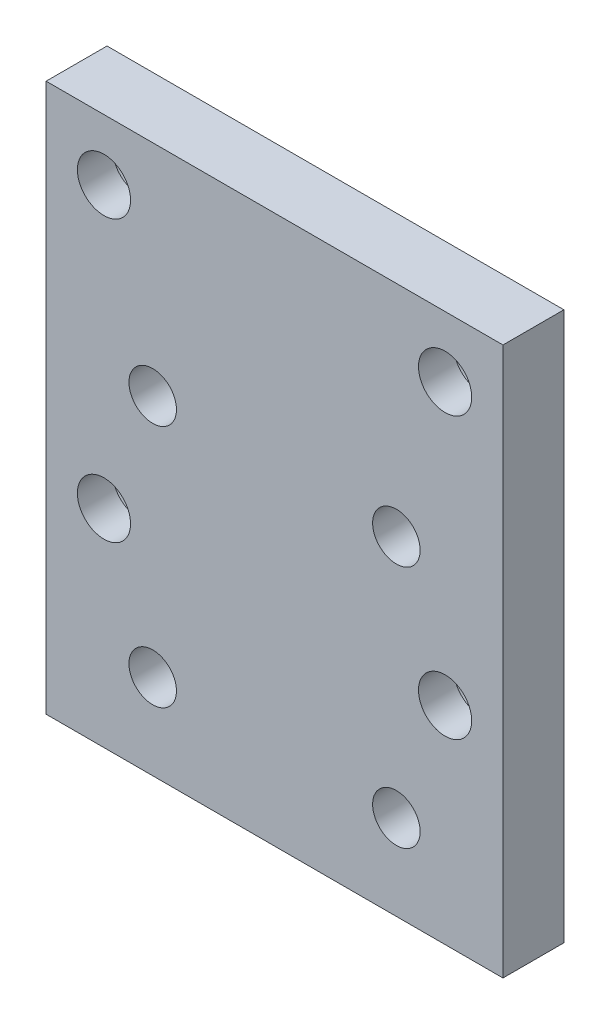
ISO-10303-21;
HEADER;
FILE_DESCRIPTION(('STEP AP214'),'2;1');
FILE_NAME('part.step','',(''),(''),'','','');
FILE_SCHEMA(('AUTOMOTIVE_DESIGN { 1 0 10303 214 1 1 1 1 }'));
ENDSEC;
DATA;
#1=APPLICATION_CONTEXT('core data for automotive mechanical design processes');
#2=APPLICATION_PROTOCOL_DEFINITION('international standard','automotive_design',2000,#1);
#3=PRODUCT_CONTEXT('',#1,'mechanical');
#4=PRODUCT('Part','Part','',(#3));
#5=PRODUCT_RELATED_PRODUCT_CATEGORY('part','',(#4));
#6=PRODUCT_DEFINITION_FORMATION('','',#4);
#7=PRODUCT_DEFINITION_CONTEXT('part definition',#1,'design');
#8=PRODUCT_DEFINITION('design','',#6,#7);
#9=PRODUCT_DEFINITION_SHAPE('','',#8);
#10=(LENGTH_UNIT() NAMED_UNIT(*) SI_UNIT(.MILLI.,.METRE.));
#11=(NAMED_UNIT(*) PLANE_ANGLE_UNIT() SI_UNIT($,.RADIAN.));
#12=(NAMED_UNIT(*) SI_UNIT($,.STERADIAN.) SOLID_ANGLE_UNIT());
#13=UNCERTAINTY_MEASURE_WITH_UNIT(LENGTH_MEASURE(1.E-05),#10,'distance_accuracy_value','');
#14=(GEOMETRIC_REPRESENTATION_CONTEXT(3) GLOBAL_UNCERTAINTY_ASSIGNED_CONTEXT((#13)) GLOBAL_UNIT_ASSIGNED_CONTEXT((#10,
#11,#12)) REPRESENTATION_CONTEXT('',''));
#15=CARTESIAN_POINT('',(0.,0.,0.));
#16=DIRECTION('',(0.,0.,1.));
#17=DIRECTION('',(1.,0.,0.));
#18=AXIS2_PLACEMENT_3D('',#15,#16,#17);
#19=CARTESIAN_POINT('',(75.,-45.,-5.));
#20=DIRECTION('',(0.,0.,1.));
#21=DIRECTION('',(1.,0.,0.));
#22=AXIS2_PLACEMENT_3D('',#19,#20,#21);
#23=PLANE('',#22);
#24=CARTESIAN_POINT('',(17.5,-31.,-5.));
#25=DIRECTION('',(0.,0.,-1.));
#26=DIRECTION('',(-1.,0.,0.));
#27=AXIS2_PLACEMENT_3D('',#24,#25,#26);
#28=CIRCLE('',#27,3.9);
#29=CARTESIAN_POINT('',(13.6,-31.,-5.));
#30=VERTEX_POINT('',#29);
#31=EDGE_CURVE('E216',#30,#30,#28,.T.);
#32=ORIENTED_EDGE('',*,*,#31,.F.);
#33=EDGE_LOOP('',(#32));
#34=FACE_BOUND('',#33,.T.);
#35=CARTESIAN_POINT('',(17.5,8.99999999999999,-5.));
#36=DIRECTION('',(0.,0.,-1.));
#37=DIRECTION('',(-1.,0.,0.));
#38=AXIS2_PLACEMENT_3D('',#35,#36,#37);
#39=CIRCLE('',#38,3.9);
#40=CARTESIAN_POINT('',(13.6,8.99999999999999,-5.));
#41=VERTEX_POINT('',#40);
#42=EDGE_CURVE('E224',#41,#41,#39,.T.);
#43=ORIENTED_EDGE('',*,*,#42,.F.);
#44=EDGE_LOOP('',(#43));
#45=FACE_BOUND('',#44,.T.);
#46=CARTESIAN_POINT('',(57.5,8.99999999999999,-5.));
#47=DIRECTION('',(0.,0.,-1.));
#48=DIRECTION('',(-1.,0.,0.));
#49=AXIS2_PLACEMENT_3D('',#46,#47,#48);
#50=CIRCLE('',#49,3.9);
#51=CARTESIAN_POINT('',(53.6,8.99999999999999,-5.));
#52=VERTEX_POINT('',#51);
#53=EDGE_CURVE('E232',#52,#52,#50,.T.);
#54=ORIENTED_EDGE('',*,*,#53,.F.);
#55=EDGE_LOOP('',(#54));
#56=FACE_BOUND('',#55,.T.);
#57=CARTESIAN_POINT('',(57.5,-31.,-5.));
#58=DIRECTION('',(0.,0.,-1.));
#59=DIRECTION('',(-1.,0.,0.));
#60=AXIS2_PLACEMENT_3D('',#57,#58,#59);
#61=CIRCLE('',#60,3.9);
#62=CARTESIAN_POINT('',(53.6,-31.,-5.));
#63=VERTEX_POINT('',#62);
#64=EDGE_CURVE('E208',#63,#63,#61,.T.);
#65=ORIENTED_EDGE('',*,*,#64,.F.);
#66=EDGE_LOOP('',(#65));
#67=FACE_BOUND('',#66,.T.);
#68=CARTESIAN_POINT('',(65.5,35.,-5.));
#69=DIRECTION('',(0.,0.,-1.));
#70=DIRECTION('',(-1.,0.,0.));
#71=AXIS2_PLACEMENT_3D('',#68,#69,#70);
#72=CIRCLE('',#71,7.97687);
#73=CARTESIAN_POINT('',(57.52313,35.,-5.));
#74=VERTEX_POINT('',#73);
#75=EDGE_CURVE('E203',#74,#74,#72,.T.);
#76=ORIENTED_EDGE('',*,*,#75,.F.);
#77=EDGE_LOOP('',(#76));
#78=FACE_BOUND('',#77,.T.);
#79=CARTESIAN_POINT('',(65.5,-11.,-5.));
#80=DIRECTION('',(0.,0.,-1.));
#81=DIRECTION('',(-1.,0.,0.));
#82=AXIS2_PLACEMENT_3D('',#79,#80,#81);
#83=CIRCLE('',#82,7.97687);
#84=CARTESIAN_POINT('',(57.52313,-11.,-5.));
#85=VERTEX_POINT('',#84);
#86=EDGE_CURVE('E183',#85,#85,#83,.T.);
#87=ORIENTED_EDGE('',*,*,#86,.F.);
#88=EDGE_LOOP('',(#87));
#89=FACE_BOUND('',#88,.T.);
#90=CARTESIAN_POINT('',(9.49999999999999,35.,-5.));
#91=DIRECTION('',(0.,0.,-1.));
#92=DIRECTION('',(-1.,0.,0.));
#93=AXIS2_PLACEMENT_3D('',#90,#91,#92);
#94=CIRCLE('',#93,7.97687);
#95=CARTESIAN_POINT('',(1.52312999999999,35.,-5.));
#96=VERTEX_POINT('',#95);
#97=EDGE_CURVE('E163',#96,#96,#94,.T.);
#98=ORIENTED_EDGE('',*,*,#97,.F.);
#99=EDGE_LOOP('',(#98));
#100=FACE_BOUND('',#99,.T.);
#101=CARTESIAN_POINT('',(9.49999999999998,-11.,-5.));
#102=DIRECTION('',(0.,0.,-1.));
#103=DIRECTION('',(-1.,0.,0.));
#104=AXIS2_PLACEMENT_3D('',#101,#102,#103);
#105=CIRCLE('',#104,7.97687);
#106=CARTESIAN_POINT('',(1.52312999999998,-11.,-5.));
#107=VERTEX_POINT('',#106);
#108=EDGE_CURVE('E143',#107,#107,#105,.T.);
#109=ORIENTED_EDGE('',*,*,#108,.F.);
#110=EDGE_LOOP('',(#109));
#111=FACE_BOUND('',#110,.T.);
#112=DIRECTION('',(0.,1.,0.));
#113=VECTOR('',#112,1.);
#114=CARTESIAN_POINT('',(0.,-45.,-5.));
#115=LINE('',#114,#113);
#116=CARTESIAN_POINT('',(0.,-45.,-5.));
#117=VERTEX_POINT('',#116);
#118=CARTESIAN_POINT('',(0.,45.,-5.));
#119=VERTEX_POINT('',#118);
#120=EDGE_CURVE('E107',#117,#119,#115,.T.);
#121=ORIENTED_EDGE('',*,*,#120,.T.);
#122=DIRECTION('',(-1.,0.,0.));
#123=VECTOR('',#122,1.);
#124=CARTESIAN_POINT('',(75.,45.,-5.));
#125=LINE('',#124,#123);
#126=CARTESIAN_POINT('',(75.,45.,-5.));
#127=VERTEX_POINT('',#126);
#128=EDGE_CURVE('E11',#127,#119,#125,.T.);
#129=ORIENTED_EDGE('',*,*,#128,.F.);
#130=DIRECTION('',(0.,1.,0.));
#131=VECTOR('',#130,1.);
#132=CARTESIAN_POINT('',(75.,-45.,-5.));
#133=LINE('',#132,#131);
#134=CARTESIAN_POINT('',(75.,-45.,-5.));
#135=VERTEX_POINT('',#134);
#136=EDGE_CURVE('E91',#135,#127,#133,.T.);
#137=ORIENTED_EDGE('',*,*,#136,.F.);
#138=DIRECTION('',(-1.,0.,0.));
#139=VECTOR('',#138,1.);
#140=CARTESIAN_POINT('',(75.,-45.,-5.));
#141=LINE('',#140,#139);
#142=EDGE_CURVE('E103',#135,#117,#141,.T.);
#143=ORIENTED_EDGE('',*,*,#142,.T.);
#144=EDGE_LOOP('',(#121,#129,#137,#143));
#145=FACE_BOUND('',#144,.T.);
#146=ADVANCED_FACE('F39',(#34,#45,#56,#67,#78,#89,#100,#111,#145),#23,.F.);
#147=CARTESIAN_POINT('',(75.,45.,5.));
#148=DIRECTION('',(0.,-1.,0.));
#149=DIRECTION('',(0.,0.,-1.));
#150=AXIS2_PLACEMENT_3D('',#147,#148,#149);
#151=PLANE('',#150);
#152=DIRECTION('',(0.,0.,1.));
#153=VECTOR('',#152,1.);
#154=CARTESIAN_POINT('',(0.,45.,5.));
#155=LINE('',#154,#153);
#156=CARTESIAN_POINT('',(0.,45.,5.));
#157=VERTEX_POINT('',#156);
#158=EDGE_CURVE('E96',#119,#157,#155,.T.);
#159=ORIENTED_EDGE('',*,*,#158,.T.);
#160=DIRECTION('',(-1.,0.,0.));
#161=VECTOR('',#160,1.);
#162=CARTESIAN_POINT('',(75.,45.,5.));
#163=LINE('',#162,#161);
#164=CARTESIAN_POINT('',(75.,45.,5.));
#165=VERTEX_POINT('',#164);
#166=EDGE_CURVE('E48',#165,#157,#163,.T.);
#167=ORIENTED_EDGE('',*,*,#166,.F.);
#168=DIRECTION('',(0.,0.,1.));
#169=VECTOR('',#168,1.);
#170=CARTESIAN_POINT('',(75.,45.,5.));
#171=LINE('',#170,#169);
#172=EDGE_CURVE('E86',#127,#165,#171,.T.);
#173=ORIENTED_EDGE('',*,*,#172,.F.);
#174=ORIENTED_EDGE('',*,*,#128,.T.);
#175=EDGE_LOOP('',(#159,#167,#173,#174));
#176=FACE_BOUND('',#175,.T.);
#177=ADVANCED_FACE('F95',(#176),#151,.F.);
#178=CARTESIAN_POINT('',(75.,-45.,5.));
#179=DIRECTION('',(0.,0.,-1.));
#180=DIRECTION('',(-1.,0.,0.));
#181=AXIS2_PLACEMENT_3D('',#178,#179,#180);
#182=PLANE('',#181);
#183=CARTESIAN_POINT('',(17.5,-31.,5.));
#184=DIRECTION('',(0.,0.,-1.));
#185=DIRECTION('',(-1.,0.,0.));
#186=AXIS2_PLACEMENT_3D('',#183,#184,#185);
#187=CIRCLE('',#186,3.9);
#188=CARTESIAN_POINT('',(13.6,-31.,5.));
#189=VERTEX_POINT('',#188);
#190=EDGE_CURVE('E220',#189,#189,#187,.T.);
#191=ORIENTED_EDGE('',*,*,#190,.T.);
#192=EDGE_LOOP('',(#191));
#193=FACE_BOUND('',#192,.T.);
#194=CARTESIAN_POINT('',(17.5,8.99999999999999,5.));
#195=DIRECTION('',(0.,0.,-1.));
#196=DIRECTION('',(-1.,0.,0.));
#197=AXIS2_PLACEMENT_3D('',#194,#195,#196);
#198=CIRCLE('',#197,3.9);
#199=CARTESIAN_POINT('',(13.6,8.99999999999999,5.));
#200=VERTEX_POINT('',#199);
#201=EDGE_CURVE('E228',#200,#200,#198,.T.);
#202=ORIENTED_EDGE('',*,*,#201,.T.);
#203=EDGE_LOOP('',(#202));
#204=FACE_BOUND('',#203,.T.);
#205=CARTESIAN_POINT('',(57.5,8.99999999999999,5.));
#206=DIRECTION('',(0.,0.,-1.));
#207=DIRECTION('',(-1.,0.,0.));
#208=AXIS2_PLACEMENT_3D('',#205,#206,#207);
#209=CIRCLE('',#208,3.9);
#210=CARTESIAN_POINT('',(53.6,8.99999999999999,5.));
#211=VERTEX_POINT('',#210);
#212=EDGE_CURVE('E212',#211,#211,#209,.T.);
#213=ORIENTED_EDGE('',*,*,#212,.T.);
#214=EDGE_LOOP('',(#213));
#215=FACE_BOUND('',#214,.T.);
#216=CARTESIAN_POINT('',(57.5,-31.,5.));
#217=DIRECTION('',(0.,0.,-1.));
#218=DIRECTION('',(-1.,0.,0.));
#219=AXIS2_PLACEMENT_3D('',#216,#217,#218);
#220=CIRCLE('',#219,3.9);
#221=CARTESIAN_POINT('',(53.6,-31.,5.));
#222=VERTEX_POINT('',#221);
#223=EDGE_CURVE('E207',#222,#222,#220,.T.);
#224=ORIENTED_EDGE('',*,*,#223,.T.);
#225=EDGE_LOOP('',(#224));
#226=FACE_BOUND('',#225,.T.);
#227=CARTESIAN_POINT('',(65.5,35.,5.));
#228=DIRECTION('',(0.,0.,-1.));
#229=DIRECTION('',(-1.,0.,0.));
#230=AXIS2_PLACEMENT_3D('',#227,#228,#229);
#231=CIRCLE('',#230,4.36499);
#232=CARTESIAN_POINT('',(61.13501,35.,5.));
#233=VERTEX_POINT('',#232);
#234=EDGE_CURVE('E187',#233,#233,#231,.T.);
#235=ORIENTED_EDGE('',*,*,#234,.T.);
#236=EDGE_LOOP('',(#235));
#237=FACE_BOUND('',#236,.T.);
#238=CARTESIAN_POINT('',(65.5,-11.,5.));
#239=DIRECTION('',(0.,0.,-1.));
#240=DIRECTION('',(-1.,0.,0.));
#241=AXIS2_PLACEMENT_3D('',#238,#239,#240);
#242=CIRCLE('',#241,4.36499);
#243=CARTESIAN_POINT('',(61.13501,-11.,5.));
#244=VERTEX_POINT('',#243);
#245=EDGE_CURVE('E167',#244,#244,#242,.T.);
#246=ORIENTED_EDGE('',*,*,#245,.T.);
#247=EDGE_LOOP('',(#246));
#248=FACE_BOUND('',#247,.T.);
#249=CARTESIAN_POINT('',(9.49999999999999,35.,5.));
#250=DIRECTION('',(0.,0.,-1.));
#251=DIRECTION('',(-1.,0.,0.));
#252=AXIS2_PLACEMENT_3D('',#249,#250,#251);
#253=CIRCLE('',#252,4.36499);
#254=CARTESIAN_POINT('',(5.13501,35.,5.));
#255=VERTEX_POINT('',#254);
#256=EDGE_CURVE('E147',#255,#255,#253,.T.);
#257=ORIENTED_EDGE('',*,*,#256,.T.);
#258=EDGE_LOOP('',(#257));
#259=FACE_BOUND('',#258,.T.);
#260=CARTESIAN_POINT('',(9.49999999999998,-11.,5.));
#261=DIRECTION('',(0.,0.,-1.));
#262=DIRECTION('',(-1.,0.,0.));
#263=AXIS2_PLACEMENT_3D('',#260,#261,#262);
#264=CIRCLE('',#263,4.36499);
#265=CARTESIAN_POINT('',(5.13500999999998,-11.,5.));
#266=VERTEX_POINT('',#265);
#267=EDGE_CURVE('E111',#266,#266,#264,.T.);
#268=ORIENTED_EDGE('',*,*,#267,.T.);
#269=EDGE_LOOP('',(#268));
#270=FACE_BOUND('',#269,.T.);
#271=DIRECTION('',(0.,-1.,0.));
#272=VECTOR('',#271,1.);
#273=CARTESIAN_POINT('',(0.,-45.,5.));
#274=LINE('',#273,#272);
#275=CARTESIAN_POINT('',(0.,-45.,5.));
#276=VERTEX_POINT('',#275);
#277=EDGE_CURVE('E73',#157,#276,#274,.T.);
#278=ORIENTED_EDGE('',*,*,#277,.T.);
#279=DIRECTION('',(-1.,0.,0.));
#280=VECTOR('',#279,1.);
#281=CARTESIAN_POINT('',(75.,-45.,5.));
#282=LINE('',#281,#280);
#283=CARTESIAN_POINT('',(75.,-45.,5.));
#284=VERTEX_POINT('',#283);
#285=EDGE_CURVE('E98',#284,#276,#282,.T.);
#286=ORIENTED_EDGE('',*,*,#285,.F.);
#287=DIRECTION('',(0.,-1.,0.));
#288=VECTOR('',#287,1.);
#289=CARTESIAN_POINT('',(75.,-45.,5.));
#290=LINE('',#289,#288);
#291=EDGE_CURVE('E89',#165,#284,#290,.T.);
#292=ORIENTED_EDGE('',*,*,#291,.F.);
#293=ORIENTED_EDGE('',*,*,#166,.T.);
#294=EDGE_LOOP('',(#278,#286,#292,#293));
#295=FACE_BOUND('',#294,.T.);
#296=ADVANCED_FACE('F99',(#193,#204,#215,#226,#237,#248,#259,#270,#295),#182,.F.);
#297=CARTESIAN_POINT('',(75.,-45.,5.));
#298=DIRECTION('',(0.,1.,0.));
#299=DIRECTION('',(0.,0.,1.));
#300=AXIS2_PLACEMENT_3D('',#297,#298,#299);
#301=PLANE('',#300);
#302=DIRECTION('',(0.,0.,-1.));
#303=VECTOR('',#302,1.);
#304=CARTESIAN_POINT('',(0.,-45.,5.));
#305=LINE('',#304,#303);
#306=EDGE_CURVE('E79',#276,#117,#305,.T.);
#307=ORIENTED_EDGE('',*,*,#306,.T.);
#308=ORIENTED_EDGE('',*,*,#142,.F.);
#309=DIRECTION('',(0.,0.,-1.));
#310=VECTOR('',#309,1.);
#311=CARTESIAN_POINT('',(75.,-45.,5.));
#312=LINE('',#311,#310);
#313=EDGE_CURVE('E56',#284,#135,#312,.T.);
#314=ORIENTED_EDGE('',*,*,#313,.F.);
#315=ORIENTED_EDGE('',*,*,#285,.T.);
#316=EDGE_LOOP('',(#307,#308,#314,#315));
#317=FACE_BOUND('',#316,.T.);
#318=ADVANCED_FACE('F121',(#317),#301,.F.);
#319=CARTESIAN_POINT('',(75.,0.,0.));
#320=DIRECTION('',(-1.,0.,0.));
#321=DIRECTION('',(0.,0.,1.));
#322=AXIS2_PLACEMENT_3D('',#319,#320,#321);
#323=PLANE('',#322);
#324=ORIENTED_EDGE('',*,*,#136,.T.);
#325=ORIENTED_EDGE('',*,*,#172,.T.);
#326=ORIENTED_EDGE('',*,*,#291,.T.);
#327=ORIENTED_EDGE('',*,*,#313,.T.);
#328=EDGE_LOOP('',(#324,#325,#326,#327));
#329=FACE_BOUND('',#328,.T.);
#330=ADVANCED_FACE('F87',(#329),#323,.F.);
#331=CARTESIAN_POINT('',(0.,0.,0.));
#332=DIRECTION('',(-1.,0.,0.));
#333=DIRECTION('',(0.,0.,1.));
#334=AXIS2_PLACEMENT_3D('',#331,#332,#333);
#335=PLANE('',#334);
#336=ORIENTED_EDGE('',*,*,#120,.F.);
#337=ORIENTED_EDGE('',*,*,#306,.F.);
#338=ORIENTED_EDGE('',*,*,#277,.F.);
#339=ORIENTED_EDGE('',*,*,#158,.F.);
#340=EDGE_LOOP('',(#336,#337,#338,#339));
#341=FACE_BOUND('',#340,.T.);
#342=ADVANCED_FACE('F124',(#341),#335,.T.);
#343=CARTESIAN_POINT('',(9.49999999999998,-11.,-5.));
#344=DIRECTION('',(0.,0.,-1.));
#345=DIRECTION('',(-1.,0.,0.));
#346=AXIS2_PLACEMENT_3D('',#343,#344,#345);
#347=CYLINDRICAL_SURFACE('',#346,4.36499);
#348=ORIENTED_EDGE('',*,*,#267,.F.);
#349=EDGE_LOOP('',(#348));
#350=FACE_BOUND('',#349,.T.);
#351=CARTESIAN_POINT('',(9.49999999999998,-11.,-0.783600000000001));
#352=DIRECTION('',(0.,0.,-1.));
#353=DIRECTION('',(-1.,0.,0.));
#354=AXIS2_PLACEMENT_3D('',#351,#352,#353);
#355=CIRCLE('',#354,4.36499);
#356=CARTESIAN_POINT('',(5.13500999999998,-11.,-0.783600000000001));
#357=VERTEX_POINT('',#356);
#358=EDGE_CURVE('E131',#357,#357,#355,.T.);
#359=ORIENTED_EDGE('',*,*,#358,.T.);
#360=EDGE_LOOP('',(#359));
#361=FACE_BOUND('',#360,.T.);
#362=ADVANCED_FACE('F284',(#350,#361),#347,.F.);
#363=CARTESIAN_POINT('',(16.84187,-11.,-0.783600000000001));
#364=DIRECTION('',(0.,0.,1.));
#365=DIRECTION('',(1.,0.,0.));
#366=AXIS2_PLACEMENT_3D('',#363,#364,#365);
#367=PLANE('',#366);
#368=ORIENTED_EDGE('',*,*,#358,.F.);
#369=EDGE_LOOP('',(#368));
#370=FACE_BOUND('',#369,.T.);
#371=CARTESIAN_POINT('',(9.49999999999998,-11.,-0.783600000000001));
#372=DIRECTION('',(0.,0.,-1.));
#373=DIRECTION('',(-1.,0.,0.));
#374=AXIS2_PLACEMENT_3D('',#371,#372,#373);
#375=CIRCLE('',#374,7.34187);
#376=CARTESIAN_POINT('',(2.15812999999998,-11.,-0.783600000000001));
#377=VERTEX_POINT('',#376);
#378=EDGE_CURVE('E135',#377,#377,#375,.T.);
#379=ORIENTED_EDGE('',*,*,#378,.T.);
#380=EDGE_LOOP('',(#379));
#381=FACE_BOUND('',#380,.T.);
#382=ADVANCED_FACE('F276',(#370,#381),#367,.F.);
#383=CARTESIAN_POINT('',(9.49999999999998,-11.,-5.));
#384=DIRECTION('',(0.,0.,-1.));
#385=DIRECTION('',(-1.,0.,0.));
#386=AXIS2_PLACEMENT_3D('',#383,#384,#385);
#387=CYLINDRICAL_SURFACE('',#386,7.34187);
#388=ORIENTED_EDGE('',*,*,#378,.F.);
#389=EDGE_LOOP('',(#388));
#390=FACE_BOUND('',#389,.T.);
#391=CARTESIAN_POINT('',(9.49999999999998,-11.,-4.365));
#392=DIRECTION('',(0.,0.,-1.));
#393=DIRECTION('',(-1.,0.,0.));
#394=AXIS2_PLACEMENT_3D('',#391,#392,#393);
#395=CIRCLE('',#394,7.34187);
#396=CARTESIAN_POINT('',(2.15812999999998,-11.,-4.365));
#397=VERTEX_POINT('',#396);
#398=EDGE_CURVE('E139',#397,#397,#395,.T.);
#399=ORIENTED_EDGE('',*,*,#398,.T.);
#400=EDGE_LOOP('',(#399));
#401=FACE_BOUND('',#400,.T.);
#402=ADVANCED_FACE('F266',(#390,#401),#387,.F.);
#403=CARTESIAN_POINT('',(9.49999999999998,-11.,-5.));
#404=DIRECTION('',(0.,0.,-1.));
#405=DIRECTION('',(-1.,0.,0.));
#406=AXIS2_PLACEMENT_3D('',#403,#404,#405);
#407=CONICAL_SURFACE('',#406,7.97687,0.785398163397447);
#408=ORIENTED_EDGE('',*,*,#398,.F.);
#409=EDGE_LOOP('',(#408));
#410=FACE_BOUND('',#409,.T.);
#411=ORIENTED_EDGE('',*,*,#108,.T.);
#412=EDGE_LOOP('',(#411));
#413=FACE_BOUND('',#412,.T.);
#414=ADVANCED_FACE('F263',(#410,#413),#407,.F.);
#415=CARTESIAN_POINT('',(9.49999999999999,35.,-5.));
#416=DIRECTION('',(0.,0.,-1.));
#417=DIRECTION('',(-1.,0.,0.));
#418=AXIS2_PLACEMENT_3D('',#415,#416,#417);
#419=CYLINDRICAL_SURFACE('',#418,4.36499);
#420=ORIENTED_EDGE('',*,*,#256,.F.);
#421=EDGE_LOOP('',(#420));
#422=FACE_BOUND('',#421,.T.);
#423=CARTESIAN_POINT('',(9.49999999999999,35.,-0.783600000000001));
#424=DIRECTION('',(0.,0.,-1.));
#425=DIRECTION('',(-1.,0.,0.));
#426=AXIS2_PLACEMENT_3D('',#423,#424,#425);
#427=CIRCLE('',#426,4.36499);
#428=CARTESIAN_POINT('',(5.13500999999999,35.,-0.783600000000001));
#429=VERTEX_POINT('',#428);
#430=EDGE_CURVE('E151',#429,#429,#427,.T.);
#431=ORIENTED_EDGE('',*,*,#430,.T.);
#432=EDGE_LOOP('',(#431));
#433=FACE_BOUND('',#432,.T.);
#434=ADVANCED_FACE('F265',(#422,#433),#419,.F.);
#435=CARTESIAN_POINT('',(16.84187,35.,-0.783600000000001));
#436=DIRECTION('',(0.,0.,1.));
#437=DIRECTION('',(1.,0.,0.));
#438=AXIS2_PLACEMENT_3D('',#435,#436,#437);
#439=PLANE('',#438);
#440=ORIENTED_EDGE('',*,*,#430,.F.);
#441=EDGE_LOOP('',(#440));
#442=FACE_BOUND('',#441,.T.);
#443=CARTESIAN_POINT('',(9.49999999999999,35.,-0.783600000000001));
#444=DIRECTION('',(0.,0.,-1.));
#445=DIRECTION('',(-1.,0.,0.));
#446=AXIS2_PLACEMENT_3D('',#443,#444,#445);
#447=CIRCLE('',#446,7.34187);
#448=CARTESIAN_POINT('',(2.15812999999999,35.,-0.783600000000001));
#449=VERTEX_POINT('',#448);
#450=EDGE_CURVE('E155',#449,#449,#447,.T.);
#451=ORIENTED_EDGE('',*,*,#450,.T.);
#452=EDGE_LOOP('',(#451));
#453=FACE_BOUND('',#452,.T.);
#454=ADVANCED_FACE('F273',(#442,#453),#439,.F.);
#455=CARTESIAN_POINT('',(9.49999999999999,35.,-5.));
#456=DIRECTION('',(0.,0.,-1.));
#457=DIRECTION('',(-1.,0.,0.));
#458=AXIS2_PLACEMENT_3D('',#455,#456,#457);
#459=CYLINDRICAL_SURFACE('',#458,7.34187);
#460=ORIENTED_EDGE('',*,*,#450,.F.);
#461=EDGE_LOOP('',(#460));
#462=FACE_BOUND('',#461,.T.);
#463=CARTESIAN_POINT('',(9.49999999999999,35.,-4.365));
#464=DIRECTION('',(0.,0.,-1.));
#465=DIRECTION('',(-1.,0.,0.));
#466=AXIS2_PLACEMENT_3D('',#463,#464,#465);
#467=CIRCLE('',#466,7.34187);
#468=CARTESIAN_POINT('',(2.15812999999999,35.,-4.365));
#469=VERTEX_POINT('',#468);
#470=EDGE_CURVE('E159',#469,#469,#467,.T.);
#471=ORIENTED_EDGE('',*,*,#470,.T.);
#472=EDGE_LOOP('',(#471));
#473=FACE_BOUND('',#472,.T.);
#474=ADVANCED_FACE('F350',(#462,#473),#459,.F.);
#475=CARTESIAN_POINT('',(9.49999999999999,35.,-5.));
#476=DIRECTION('',(0.,0.,-1.));
#477=DIRECTION('',(-1.,0.,0.));
#478=AXIS2_PLACEMENT_3D('',#475,#476,#477);
#479=CONICAL_SURFACE('',#478,7.97687,0.785398163397447);
#480=ORIENTED_EDGE('',*,*,#470,.F.);
#481=EDGE_LOOP('',(#480));
#482=FACE_BOUND('',#481,.T.);
#483=ORIENTED_EDGE('',*,*,#97,.T.);
#484=EDGE_LOOP('',(#483));
#485=FACE_BOUND('',#484,.T.);
#486=ADVANCED_FACE('F359',(#482,#485),#479,.F.);
#487=CARTESIAN_POINT('',(65.5,-11.,-5.));
#488=DIRECTION('',(0.,0.,-1.));
#489=DIRECTION('',(-1.,0.,0.));
#490=AXIS2_PLACEMENT_3D('',#487,#488,#489);
#491=CYLINDRICAL_SURFACE('',#490,4.36499);
#492=ORIENTED_EDGE('',*,*,#245,.F.);
#493=EDGE_LOOP('',(#492));
#494=FACE_BOUND('',#493,.T.);
#495=CARTESIAN_POINT('',(65.5,-11.,-0.783600000000001));
#496=DIRECTION('',(0.,0.,-1.));
#497=DIRECTION('',(-1.,0.,0.));
#498=AXIS2_PLACEMENT_3D('',#495,#496,#497);
#499=CIRCLE('',#498,4.36499);
#500=CARTESIAN_POINT('',(61.13501,-11.,-0.783600000000001));
#501=VERTEX_POINT('',#500);
#502=EDGE_CURVE('E171',#501,#501,#499,.T.);
#503=ORIENTED_EDGE('',*,*,#502,.T.);
#504=EDGE_LOOP('',(#503));
#505=FACE_BOUND('',#504,.T.);
#506=ADVANCED_FACE('F369',(#494,#505),#491,.F.);
#507=CARTESIAN_POINT('',(72.84187,-11.,-0.783600000000001));
#508=DIRECTION('',(0.,0.,1.));
#509=DIRECTION('',(1.,0.,0.));
#510=AXIS2_PLACEMENT_3D('',#507,#508,#509);
#511=PLANE('',#510);
#512=ORIENTED_EDGE('',*,*,#502,.F.);
#513=EDGE_LOOP('',(#512));
#514=FACE_BOUND('',#513,.T.);
#515=CARTESIAN_POINT('',(65.5,-11.,-0.783600000000001));
#516=DIRECTION('',(0.,0.,-1.));
#517=DIRECTION('',(-1.,0.,0.));
#518=AXIS2_PLACEMENT_3D('',#515,#516,#517);
#519=CIRCLE('',#518,7.34187);
#520=CARTESIAN_POINT('',(58.15813,-11.,-0.783600000000001));
#521=VERTEX_POINT('',#520);
#522=EDGE_CURVE('E175',#521,#521,#519,.T.);
#523=ORIENTED_EDGE('',*,*,#522,.T.);
#524=EDGE_LOOP('',(#523));
#525=FACE_BOUND('',#524,.T.);
#526=ADVANCED_FACE('F379',(#514,#525),#511,.F.);
#527=CARTESIAN_POINT('',(65.5,-11.,-5.));
#528=DIRECTION('',(0.,0.,-1.));
#529=DIRECTION('',(-1.,0.,0.));
#530=AXIS2_PLACEMENT_3D('',#527,#528,#529);
#531=CYLINDRICAL_SURFACE('',#530,7.34187);
#532=ORIENTED_EDGE('',*,*,#522,.F.);
#533=EDGE_LOOP('',(#532));
#534=FACE_BOUND('',#533,.T.);
#535=CARTESIAN_POINT('',(65.5,-11.,-4.365));
#536=DIRECTION('',(0.,0.,-1.));
#537=DIRECTION('',(-1.,0.,0.));
#538=AXIS2_PLACEMENT_3D('',#535,#536,#537);
#539=CIRCLE('',#538,7.34187);
#540=CARTESIAN_POINT('',(58.15813,-11.,-4.365));
#541=VERTEX_POINT('',#540);
#542=EDGE_CURVE('E179',#541,#541,#539,.T.);
#543=ORIENTED_EDGE('',*,*,#542,.T.);
#544=EDGE_LOOP('',(#543));
#545=FACE_BOUND('',#544,.T.);
#546=ADVANCED_FACE('F389',(#534,#545),#531,.F.);
#547=CARTESIAN_POINT('',(65.5,-11.,-5.));
#548=DIRECTION('',(0.,0.,-1.));
#549=DIRECTION('',(-1.,0.,0.));
#550=AXIS2_PLACEMENT_3D('',#547,#548,#549);
#551=CONICAL_SURFACE('',#550,7.97687,0.785398163397447);
#552=ORIENTED_EDGE('',*,*,#542,.F.);
#553=EDGE_LOOP('',(#552));
#554=FACE_BOUND('',#553,.T.);
#555=ORIENTED_EDGE('',*,*,#86,.T.);
#556=EDGE_LOOP('',(#555));
#557=FACE_BOUND('',#556,.T.);
#558=ADVANCED_FACE('F399',(#554,#557),#551,.F.);
#559=CARTESIAN_POINT('',(65.5,35.,-5.));
#560=DIRECTION('',(0.,0.,-1.));
#561=DIRECTION('',(-1.,0.,0.));
#562=AXIS2_PLACEMENT_3D('',#559,#560,#561);
#563=CYLINDRICAL_SURFACE('',#562,4.36499);
#564=ORIENTED_EDGE('',*,*,#234,.F.);
#565=EDGE_LOOP('',(#564));
#566=FACE_BOUND('',#565,.T.);
#567=CARTESIAN_POINT('',(65.5,35.,-0.783600000000001));
#568=DIRECTION('',(0.,0.,-1.));
#569=DIRECTION('',(-1.,0.,0.));
#570=AXIS2_PLACEMENT_3D('',#567,#568,#569);
#571=CIRCLE('',#570,4.36499);
#572=CARTESIAN_POINT('',(61.13501,35.,-0.783600000000001));
#573=VERTEX_POINT('',#572);
#574=EDGE_CURVE('E191',#573,#573,#571,.T.);
#575=ORIENTED_EDGE('',*,*,#574,.T.);
#576=EDGE_LOOP('',(#575));
#577=FACE_BOUND('',#576,.T.);
#578=ADVANCED_FACE('F409',(#566,#577),#563,.F.);
#579=CARTESIAN_POINT('',(72.84187,35.,-0.783600000000001));
#580=DIRECTION('',(0.,0.,1.));
#581=DIRECTION('',(1.,0.,0.));
#582=AXIS2_PLACEMENT_3D('',#579,#580,#581);
#583=PLANE('',#582);
#584=ORIENTED_EDGE('',*,*,#574,.F.);
#585=EDGE_LOOP('',(#584));
#586=FACE_BOUND('',#585,.T.);
#587=CARTESIAN_POINT('',(65.5,35.,-0.783600000000001));
#588=DIRECTION('',(0.,0.,-1.));
#589=DIRECTION('',(-1.,0.,0.));
#590=AXIS2_PLACEMENT_3D('',#587,#588,#589);
#591=CIRCLE('',#590,7.34187);
#592=CARTESIAN_POINT('',(58.15813,35.,-0.783600000000001));
#593=VERTEX_POINT('',#592);
#594=EDGE_CURVE('E195',#593,#593,#591,.T.);
#595=ORIENTED_EDGE('',*,*,#594,.T.);
#596=EDGE_LOOP('',(#595));
#597=FACE_BOUND('',#596,.T.);
#598=ADVANCED_FACE('F419',(#586,#597),#583,.F.);
#599=CARTESIAN_POINT('',(65.5,35.,-5.));
#600=DIRECTION('',(0.,0.,-1.));
#601=DIRECTION('',(-1.,0.,0.));
#602=AXIS2_PLACEMENT_3D('',#599,#600,#601);
#603=CYLINDRICAL_SURFACE('',#602,7.34187);
#604=ORIENTED_EDGE('',*,*,#594,.F.);
#605=EDGE_LOOP('',(#604));
#606=FACE_BOUND('',#605,.T.);
#607=CARTESIAN_POINT('',(65.5,35.,-4.365));
#608=DIRECTION('',(0.,0.,-1.));
#609=DIRECTION('',(-1.,0.,0.));
#610=AXIS2_PLACEMENT_3D('',#607,#608,#609);
#611=CIRCLE('',#610,7.34187);
#612=CARTESIAN_POINT('',(58.15813,35.,-4.365));
#613=VERTEX_POINT('',#612);
#614=EDGE_CURVE('E199',#613,#613,#611,.T.);
#615=ORIENTED_EDGE('',*,*,#614,.T.);
#616=EDGE_LOOP('',(#615));
#617=FACE_BOUND('',#616,.T.);
#618=ADVANCED_FACE('F429',(#606,#617),#603,.F.);
#619=CARTESIAN_POINT('',(65.5,35.,-5.));
#620=DIRECTION('',(0.,0.,-1.));
#621=DIRECTION('',(-1.,0.,0.));
#622=AXIS2_PLACEMENT_3D('',#619,#620,#621);
#623=CONICAL_SURFACE('',#622,7.97687,0.785398163397447);
#624=ORIENTED_EDGE('',*,*,#614,.F.);
#625=EDGE_LOOP('',(#624));
#626=FACE_BOUND('',#625,.T.);
#627=ORIENTED_EDGE('',*,*,#75,.T.);
#628=EDGE_LOOP('',(#627));
#629=FACE_BOUND('',#628,.T.);
#630=ADVANCED_FACE('F439',(#626,#629),#623,.F.);
#631=CARTESIAN_POINT('',(57.5,-31.,5.));
#632=DIRECTION('',(0.,0.,-1.));
#633=DIRECTION('',(-1.,0.,0.));
#634=AXIS2_PLACEMENT_3D('',#631,#632,#633);
#635=CYLINDRICAL_SURFACE('',#634,3.9);
#636=ORIENTED_EDGE('',*,*,#223,.F.);
#637=EDGE_LOOP('',(#636));
#638=FACE_BOUND('',#637,.T.);
#639=ORIENTED_EDGE('',*,*,#64,.T.);
#640=EDGE_LOOP('',(#639));
#641=FACE_BOUND('',#640,.T.);
#642=ADVANCED_FACE('F246',(#638,#641),#635,.F.);
#643=CARTESIAN_POINT('',(57.5,8.99999999999999,5.));
#644=DIRECTION('',(0.,0.,-1.));
#645=DIRECTION('',(-1.,0.,0.));
#646=AXIS2_PLACEMENT_3D('',#643,#644,#645);
#647=CYLINDRICAL_SURFACE('',#646,3.9);
#648=ORIENTED_EDGE('',*,*,#212,.F.);
#649=EDGE_LOOP('',(#648));
#650=FACE_BOUND('',#649,.T.);
#651=ORIENTED_EDGE('',*,*,#53,.T.);
#652=EDGE_LOOP('',(#651));
#653=FACE_BOUND('',#652,.T.);
#654=ADVANCED_FACE('F242',(#650,#653),#647,.F.);
#655=CARTESIAN_POINT('',(17.5,8.99999999999999,5.));
#656=DIRECTION('',(0.,0.,-1.));
#657=DIRECTION('',(-1.,0.,0.));
#658=AXIS2_PLACEMENT_3D('',#655,#656,#657);
#659=CYLINDRICAL_SURFACE('',#658,3.9);
#660=ORIENTED_EDGE('',*,*,#201,.F.);
#661=EDGE_LOOP('',(#660));
#662=FACE_BOUND('',#661,.T.);
#663=ORIENTED_EDGE('',*,*,#42,.T.);
#664=EDGE_LOOP('',(#663));
#665=FACE_BOUND('',#664,.T.);
#666=ADVANCED_FACE('F245',(#662,#665),#659,.F.);
#667=CARTESIAN_POINT('',(17.5,-31.,5.));
#668=DIRECTION('',(0.,0.,-1.));
#669=DIRECTION('',(-1.,0.,0.));
#670=AXIS2_PLACEMENT_3D('',#667,#668,#669);
#671=CYLINDRICAL_SURFACE('',#670,3.9);
#672=ORIENTED_EDGE('',*,*,#190,.F.);
#673=EDGE_LOOP('',(#672));
#674=FACE_BOUND('',#673,.T.);
#675=ORIENTED_EDGE('',*,*,#31,.T.);
#676=EDGE_LOOP('',(#675));
#677=FACE_BOUND('',#676,.T.);
#678=ADVANCED_FACE('F485',(#674,#677),#671,.F.);
#679=CLOSED_SHELL('',(#146,#177,#296,#318,#330,#342,#362,#382,#402,#414,#434,#454,#474,#486,
#506,#526,#546,#558,#578,#598,#618,#630,#642,#654,#666,#678));
#680=MANIFOLD_SOLID_BREP('B2',#679);
#681=ADVANCED_BREP_SHAPE_REPRESENTATION('',(#18,#680),#14);
#682=SHAPE_DEFINITION_REPRESENTATION(#9,#681);
ENDSEC;
END-ISO-10303-21;
